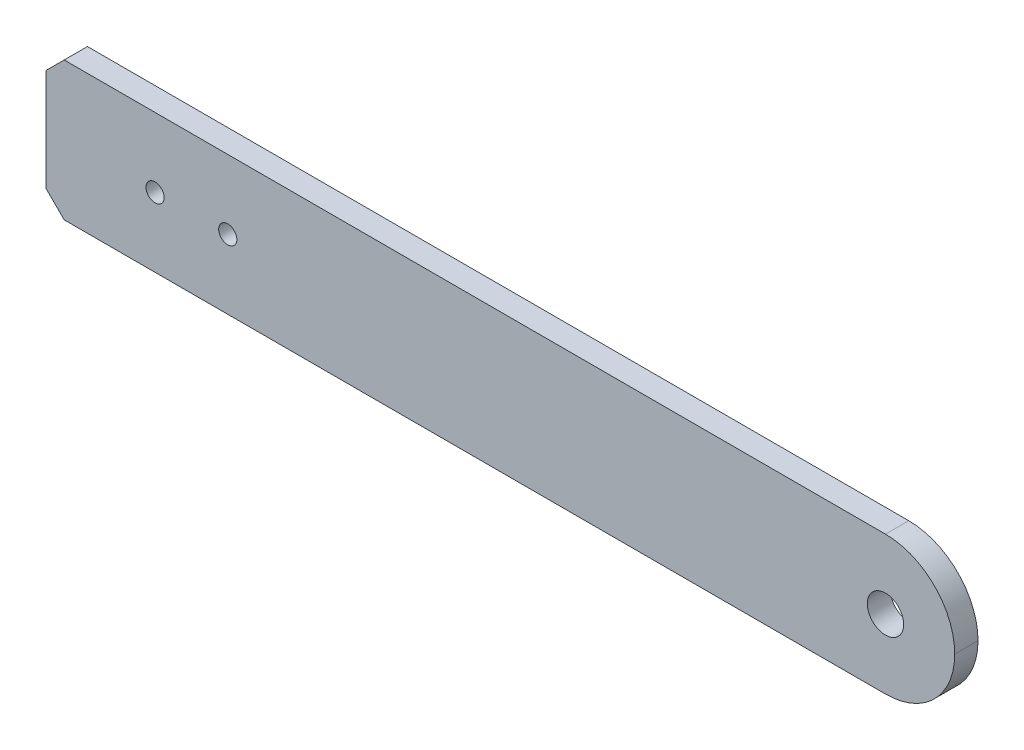
ISO-10303-21;
HEADER;
FILE_DESCRIPTION(('STEP AP214'),'2;1');
FILE_NAME('part.step','',(''),(''),'','','');
FILE_SCHEMA(('AUTOMOTIVE_DESIGN { 1 0 10303 214 1 1 1 1 }'));
ENDSEC;
DATA;
#1=APPLICATION_CONTEXT('core data for automotive mechanical design processes');
#2=APPLICATION_PROTOCOL_DEFINITION('international standard','automotive_design',2000,#1);
#3=PRODUCT_CONTEXT('',#1,'mechanical');
#4=PRODUCT('Part','Part','',(#3));
#5=PRODUCT_RELATED_PRODUCT_CATEGORY('part','',(#4));
#6=PRODUCT_DEFINITION_FORMATION('','',#4);
#7=PRODUCT_DEFINITION_CONTEXT('part definition',#1,'design');
#8=PRODUCT_DEFINITION('design','',#6,#7);
#9=PRODUCT_DEFINITION_SHAPE('','',#8);
#10=(LENGTH_UNIT() NAMED_UNIT(*) SI_UNIT(.MILLI.,.METRE.));
#11=(NAMED_UNIT(*) PLANE_ANGLE_UNIT() SI_UNIT($,.RADIAN.));
#12=(NAMED_UNIT(*) SI_UNIT($,.STERADIAN.) SOLID_ANGLE_UNIT());
#13=UNCERTAINTY_MEASURE_WITH_UNIT(LENGTH_MEASURE(1.E-05),#10,'distance_accuracy_value','');
#14=(GEOMETRIC_REPRESENTATION_CONTEXT(3) GLOBAL_UNCERTAINTY_ASSIGNED_CONTEXT((#13)) GLOBAL_UNIT_ASSIGNED_CONTEXT((#10,
#11,#12)) REPRESENTATION_CONTEXT('',''));
#15=CARTESIAN_POINT('',(0.,0.,0.));
#16=DIRECTION('',(0.,0.,1.));
#17=DIRECTION('',(1.,0.,0.));
#18=AXIS2_PLACEMENT_3D('',#15,#16,#17);
#19=CARTESIAN_POINT('',(-120.,19.05,6.4));
#20=DIRECTION('',(0.,-1.,0.));
#21=DIRECTION('',(0.,0.,-1.));
#22=AXIS2_PLACEMENT_3D('',#19,#20,#21);
#23=PLANE('',#22);
#24=DIRECTION('',(-1.,0.,0.));
#25=VECTOR('',#24,1.);
#26=CARTESIAN_POINT('',(-120.,19.05,6.4));
#27=LINE('',#26,#25);
#28=CARTESIAN_POINT('',(105.95,19.05,6.4));
#29=VERTEX_POINT('',#28);
#30=CARTESIAN_POINT('',(-120.,19.05,6.4));
#31=VERTEX_POINT('',#30);
#32=EDGE_CURVE('E104',#29,#31,#27,.T.);
#33=ORIENTED_EDGE('',*,*,#32,.F.);
#34=DIRECTION('',(0.,0.,-1.));
#35=VECTOR('',#34,1.);
#36=CARTESIAN_POINT('',(105.95,19.05,6.4));
#37=LINE('',#36,#35);
#38=CARTESIAN_POINT('',(105.95,19.05,0.));
#39=VERTEX_POINT('',#38);
#40=EDGE_CURVE('E13',#29,#39,#37,.T.);
#41=ORIENTED_EDGE('',*,*,#40,.T.);
#42=DIRECTION('',(-1.,0.,0.));
#43=VECTOR('',#42,1.);
#44=CARTESIAN_POINT('',(-120.,19.05,0.));
#45=LINE('',#44,#43);
#46=CARTESIAN_POINT('',(-120.,19.05,0.));
#47=VERTEX_POINT('',#46);
#48=EDGE_CURVE('E117',#39,#47,#45,.T.);
#49=ORIENTED_EDGE('',*,*,#48,.T.);
#50=DIRECTION('',(0.,0.,-1.));
#51=VECTOR('',#50,1.);
#52=CARTESIAN_POINT('',(-120.,19.05,6.4));
#53=LINE('',#52,#51);
#54=EDGE_CURVE('E115',#31,#47,#53,.T.);
#55=ORIENTED_EDGE('',*,*,#54,.F.);
#56=EDGE_LOOP('',(#33,#41,#49,#55));
#57=FACE_BOUND('',#56,.T.);
#58=ADVANCED_FACE('F51',(#57),#23,.F.);
#59=CARTESIAN_POINT('',(-125.,14.05,6.4));
#60=DIRECTION('',(0.707106781186547,-0.707106781186548,0.));
#61=DIRECTION('',(0.707106781186548,0.707106781186547,0.));
#62=AXIS2_PLACEMENT_3D('',#59,#60,#61);
#63=PLANE('',#62);
#64=DIRECTION('',(-0.707106781186548,-0.707106781186547,0.));
#65=VECTOR('',#64,1.);
#66=CARTESIAN_POINT('',(-125.,14.05,0.));
#67=LINE('',#66,#65);
#68=CARTESIAN_POINT('',(-125.,14.05,0.));
#69=VERTEX_POINT('',#68);
#70=EDGE_CURVE('E137',#47,#69,#67,.T.);
#71=ORIENTED_EDGE('',*,*,#70,.T.);
#72=DIRECTION('',(0.,0.,-1.));
#73=VECTOR('',#72,1.);
#74=CARTESIAN_POINT('',(-125.,14.05,6.4));
#75=LINE('',#74,#73);
#76=CARTESIAN_POINT('',(-125.,14.05,6.4));
#77=VERTEX_POINT('',#76);
#78=EDGE_CURVE('E121',#77,#69,#75,.T.);
#79=ORIENTED_EDGE('',*,*,#78,.F.);
#80=DIRECTION('',(-0.707106781186548,-0.707106781186547,0.));
#81=VECTOR('',#80,1.);
#82=CARTESIAN_POINT('',(-125.,14.05,6.4));
#83=LINE('',#82,#81);
#84=EDGE_CURVE('E108',#31,#77,#83,.T.);
#85=ORIENTED_EDGE('',*,*,#84,.F.);
#86=ORIENTED_EDGE('',*,*,#54,.T.);
#87=EDGE_LOOP('',(#71,#79,#85,#86));
#88=FACE_BOUND('',#87,.T.);
#89=ADVANCED_FACE('F123',(#88),#63,.F.);
#90=CARTESIAN_POINT('',(-125.,14.05,6.4));
#91=DIRECTION('',(1.,0.,0.));
#92=DIRECTION('',(0.,1.,0.));
#93=AXIS2_PLACEMENT_3D('',#90,#91,#92);
#94=PLANE('',#93);
#95=DIRECTION('',(0.,-1.,0.));
#96=VECTOR('',#95,1.);
#97=CARTESIAN_POINT('',(-125.,14.05,0.));
#98=LINE('',#97,#96);
#99=CARTESIAN_POINT('',(-125.,-14.05,0.));
#100=VERTEX_POINT('',#99);
#101=EDGE_CURVE('E140',#69,#100,#98,.T.);
#102=ORIENTED_EDGE('',*,*,#101,.T.);
#103=DIRECTION('',(0.,0.,-1.));
#104=VECTOR('',#103,1.);
#105=CARTESIAN_POINT('',(-125.,-14.05,6.4));
#106=LINE('',#105,#104);
#107=CARTESIAN_POINT('',(-125.,-14.05,6.4));
#108=VERTEX_POINT('',#107);
#109=EDGE_CURVE('E148',#108,#100,#106,.T.);
#110=ORIENTED_EDGE('',*,*,#109,.F.);
#111=DIRECTION('',(0.,-1.,0.));
#112=VECTOR('',#111,1.);
#113=CARTESIAN_POINT('',(-125.,14.05,6.4));
#114=LINE('',#113,#112);
#115=EDGE_CURVE('E126',#77,#108,#114,.T.);
#116=ORIENTED_EDGE('',*,*,#115,.F.);
#117=ORIENTED_EDGE('',*,*,#78,.T.);
#118=EDGE_LOOP('',(#102,#110,#116,#117));
#119=FACE_BOUND('',#118,.T.);
#120=ADVANCED_FACE('F225',(#119),#94,.F.);
#121=CARTESIAN_POINT('',(-125.,-14.05,6.4));
#122=DIRECTION('',(0.707106781186548,0.707106781186547,0.));
#123=DIRECTION('',(-0.707106781186547,0.707106781186548,0.));
#124=AXIS2_PLACEMENT_3D('',#121,#122,#123);
#125=PLANE('',#124);
#126=DIRECTION('',(0.707106781186547,-0.707106781186548,0.));
#127=VECTOR('',#126,1.);
#128=CARTESIAN_POINT('',(-125.,-14.05,0.));
#129=LINE('',#128,#127);
#130=CARTESIAN_POINT('',(-120.,-19.05,0.));
#131=VERTEX_POINT('',#130);
#132=EDGE_CURVE('E142',#100,#131,#129,.T.);
#133=ORIENTED_EDGE('',*,*,#132,.T.);
#134=DIRECTION('',(0.,0.,-1.));
#135=VECTOR('',#134,1.);
#136=CARTESIAN_POINT('',(-120.,-19.05,6.4));
#137=LINE('',#136,#135);
#138=CARTESIAN_POINT('',(-120.,-19.05,6.4));
#139=VERTEX_POINT('',#138);
#140=EDGE_CURVE('E135',#139,#131,#137,.T.);
#141=ORIENTED_EDGE('',*,*,#140,.F.);
#142=DIRECTION('',(0.707106781186547,-0.707106781186548,0.));
#143=VECTOR('',#142,1.);
#144=CARTESIAN_POINT('',(-125.,-14.05,6.4));
#145=LINE('',#144,#143);
#146=EDGE_CURVE('E128',#108,#139,#145,.T.);
#147=ORIENTED_EDGE('',*,*,#146,.F.);
#148=ORIENTED_EDGE('',*,*,#109,.T.);
#149=EDGE_LOOP('',(#133,#141,#147,#148));
#150=FACE_BOUND('',#149,.T.);
#151=ADVANCED_FACE('F170',(#150),#125,.F.);
#152=CARTESIAN_POINT('',(-120.,-19.05,6.4));
#153=DIRECTION('',(0.,1.,0.));
#154=DIRECTION('',(0.,0.,1.));
#155=AXIS2_PLACEMENT_3D('',#152,#153,#154);
#156=PLANE('',#155);
#157=DIRECTION('',(1.,0.,0.));
#158=VECTOR('',#157,1.);
#159=CARTESIAN_POINT('',(-120.,-19.05,0.));
#160=LINE('',#159,#158);
#161=CARTESIAN_POINT('',(105.95,-19.05,0.));
#162=VERTEX_POINT('',#161);
#163=EDGE_CURVE('E112',#131,#162,#160,.T.);
#164=ORIENTED_EDGE('',*,*,#163,.T.);
#165=DIRECTION('',(0.,0.,-1.));
#166=VECTOR('',#165,1.);
#167=CARTESIAN_POINT('',(105.95,-19.05,6.4));
#168=LINE('',#167,#166);
#169=CARTESIAN_POINT('',(105.95,-19.05,6.4));
#170=VERTEX_POINT('',#169);
#171=EDGE_CURVE('E155',#162,#170,#168,.F.);
#172=ORIENTED_EDGE('',*,*,#171,.T.);
#173=DIRECTION('',(1.,0.,0.));
#174=VECTOR('',#173,1.);
#175=CARTESIAN_POINT('',(-120.,-19.05,6.4));
#176=LINE('',#175,#174);
#177=EDGE_CURVE('E133',#139,#170,#176,.T.);
#178=ORIENTED_EDGE('',*,*,#177,.F.);
#179=ORIENTED_EDGE('',*,*,#140,.T.);
#180=EDGE_LOOP('',(#164,#172,#178,#179));
#181=FACE_BOUND('',#180,.T.);
#182=ADVANCED_FACE('F162',(#181),#156,.F.);
#183=CARTESIAN_POINT('',(0.,0.,6.4));
#184=DIRECTION('',(0.,0.,1.));
#185=DIRECTION('',(1.,0.,0.));
#186=AXIS2_PLACEMENT_3D('',#183,#184,#185);
#187=PLANE('',#186);
#188=CARTESIAN_POINT('',(105.95,0.,6.4));
#189=DIRECTION('',(0.,0.,1.));
#190=DIRECTION('',(1.,0.,0.));
#191=AXIS2_PLACEMENT_3D('',#188,#189,#190);
#192=CIRCLE('',#191,5.);
#193=CARTESIAN_POINT('',(110.95,0.,6.4));
#194=VERTEX_POINT('',#193);
#195=EDGE_CURVE('E186',#194,#194,#192,.T.);
#196=ORIENTED_EDGE('',*,*,#195,.F.);
#197=EDGE_LOOP('',(#196));
#198=FACE_BOUND('',#197,.T.);
#199=CARTESIAN_POINT('',(-75.,0.,6.4));
#200=DIRECTION('',(0.,0.,1.));
#201=DIRECTION('',(1.,0.,0.));
#202=AXIS2_PLACEMENT_3D('',#199,#200,#201);
#203=CIRCLE('',#202,2.49999999999999);
#204=CARTESIAN_POINT('',(-72.5,0.,6.4));
#205=VERTEX_POINT('',#204);
#206=EDGE_CURVE('E180',#205,#205,#203,.T.);
#207=ORIENTED_EDGE('',*,*,#206,.F.);
#208=EDGE_LOOP('',(#207));
#209=FACE_BOUND('',#208,.T.);
#210=CARTESIAN_POINT('',(-95.,0.,6.4));
#211=DIRECTION('',(0.,0.,1.));
#212=DIRECTION('',(1.,0.,0.));
#213=AXIS2_PLACEMENT_3D('',#210,#211,#212);
#214=CIRCLE('',#213,2.49999999999999);
#215=CARTESIAN_POINT('',(-92.5,0.,6.4));
#216=VERTEX_POINT('',#215);
#217=EDGE_CURVE('E195',#216,#216,#214,.T.);
#218=ORIENTED_EDGE('',*,*,#217,.F.);
#219=EDGE_LOOP('',(#218));
#220=FACE_BOUND('',#219,.T.);
#221=ORIENTED_EDGE('',*,*,#177,.T.);
#222=CARTESIAN_POINT('',(105.95,0.,6.4));
#223=DIRECTION('',(0.,0.,1.));
#224=DIRECTION('',(1.,0.,0.));
#225=AXIS2_PLACEMENT_3D('',#222,#223,#224);
#226=CIRCLE('',#225,19.05);
#227=CARTESIAN_POINT('',(125.,0.,6.4));
#228=VERTEX_POINT('',#227);
#229=EDGE_CURVE('E60',#170,#228,#226,.T.);
#230=ORIENTED_EDGE('',*,*,#229,.T.);
#231=CARTESIAN_POINT('',(105.95,0.,6.4));
#232=DIRECTION('',(0.,0.,1.));
#233=DIRECTION('',(1.,0.,0.));
#234=AXIS2_PLACEMENT_3D('',#231,#232,#233);
#235=CIRCLE('',#234,19.05);
#236=EDGE_CURVE('E67',#228,#29,#235,.T.);
#237=ORIENTED_EDGE('',*,*,#236,.T.);
#238=ORIENTED_EDGE('',*,*,#32,.T.);
#239=ORIENTED_EDGE('',*,*,#84,.T.);
#240=ORIENTED_EDGE('',*,*,#115,.T.);
#241=ORIENTED_EDGE('',*,*,#146,.T.);
#242=EDGE_LOOP('',(#221,#230,#237,#238,#239,#240,#241));
#243=FACE_BOUND('',#242,.T.);
#244=ADVANCED_FACE('F106',(#198,#209,#220,#243),#187,.T.);
#245=CARTESIAN_POINT('',(0.,0.,0.));
#246=DIRECTION('',(0.,0.,1.));
#247=DIRECTION('',(1.,0.,0.));
#248=AXIS2_PLACEMENT_3D('',#245,#246,#247);
#249=PLANE('',#248);
#250=CARTESIAN_POINT('',(105.95,0.,0.));
#251=DIRECTION('',(0.,0.,1.));
#252=DIRECTION('',(1.,0.,0.));
#253=AXIS2_PLACEMENT_3D('',#250,#251,#252);
#254=CIRCLE('',#253,5.);
#255=CARTESIAN_POINT('',(110.95,0.,0.));
#256=VERTEX_POINT('',#255);
#257=EDGE_CURVE('E181',#256,#256,#254,.F.);
#258=ORIENTED_EDGE('',*,*,#257,.F.);
#259=EDGE_LOOP('',(#258));
#260=FACE_BOUND('',#259,.T.);
#261=CARTESIAN_POINT('',(-75.,0.,0.));
#262=DIRECTION('',(0.,0.,1.));
#263=DIRECTION('',(1.,0.,0.));
#264=AXIS2_PLACEMENT_3D('',#261,#262,#263);
#265=CIRCLE('',#264,2.5);
#266=CARTESIAN_POINT('',(-72.5,0.,0.));
#267=VERTEX_POINT('',#266);
#268=EDGE_CURVE('E183',#267,#267,#265,.T.);
#269=ORIENTED_EDGE('',*,*,#268,.T.);
#270=EDGE_LOOP('',(#269));
#271=FACE_BOUND('',#270,.T.);
#272=CARTESIAN_POINT('',(-95.,0.,0.));
#273=DIRECTION('',(0.,0.,1.));
#274=DIRECTION('',(1.,0.,0.));
#275=AXIS2_PLACEMENT_3D('',#272,#273,#274);
#276=CIRCLE('',#275,2.5);
#277=CARTESIAN_POINT('',(-92.5,0.,0.));
#278=VERTEX_POINT('',#277);
#279=EDGE_CURVE('E138',#278,#278,#276,.T.);
#280=ORIENTED_EDGE('',*,*,#279,.T.);
#281=EDGE_LOOP('',(#280));
#282=FACE_BOUND('',#281,.T.);
#283=CARTESIAN_POINT('',(105.95,0.,0.));
#284=DIRECTION('',(0.,0.,1.));
#285=DIRECTION('',(1.,0.,0.));
#286=AXIS2_PLACEMENT_3D('',#283,#284,#285);
#287=CIRCLE('',#286,19.05);
#288=CARTESIAN_POINT('',(125.,0.,0.));
#289=VERTEX_POINT('',#288);
#290=EDGE_CURVE('E120',#39,#289,#287,.F.);
#291=ORIENTED_EDGE('',*,*,#290,.T.);
#292=CARTESIAN_POINT('',(105.95,0.,0.));
#293=DIRECTION('',(0.,0.,1.));
#294=DIRECTION('',(1.,0.,0.));
#295=AXIS2_PLACEMENT_3D('',#292,#293,#294);
#296=CIRCLE('',#295,19.05);
#297=EDGE_CURVE('E153',#289,#162,#296,.F.);
#298=ORIENTED_EDGE('',*,*,#297,.T.);
#299=ORIENTED_EDGE('',*,*,#163,.F.);
#300=ORIENTED_EDGE('',*,*,#132,.F.);
#301=ORIENTED_EDGE('',*,*,#101,.F.);
#302=ORIENTED_EDGE('',*,*,#70,.F.);
#303=ORIENTED_EDGE('',*,*,#48,.F.);
#304=EDGE_LOOP('',(#291,#298,#299,#300,#301,#302,#303));
#305=FACE_BOUND('',#304,.T.);
#306=ADVANCED_FACE('F173',(#260,#271,#282,#305),#249,.F.);
#307=CARTESIAN_POINT('',(-95.,0.,6.4));
#308=DIRECTION('',(0.,0.,1.));
#309=DIRECTION('',(1.,0.,0.));
#310=AXIS2_PLACEMENT_3D('',#307,#308,#309);
#311=CYLINDRICAL_SURFACE('',#310,2.5);
#312=ORIENTED_EDGE('',*,*,#279,.F.);
#313=EDGE_LOOP('',(#312));
#314=FACE_BOUND('',#313,.T.);
#315=ORIENTED_EDGE('',*,*,#217,.T.);
#316=EDGE_LOOP('',(#315));
#317=FACE_BOUND('',#316,.T.);
#318=ADVANCED_FACE('F201',(#314,#317),#311,.F.);
#319=CARTESIAN_POINT('',(-75.,0.,6.4));
#320=DIRECTION('',(0.,0.,1.));
#321=DIRECTION('',(1.,0.,0.));
#322=AXIS2_PLACEMENT_3D('',#319,#320,#321);
#323=CYLINDRICAL_SURFACE('',#322,2.5);
#324=ORIENTED_EDGE('',*,*,#268,.F.);
#325=EDGE_LOOP('',(#324));
#326=FACE_BOUND('',#325,.T.);
#327=ORIENTED_EDGE('',*,*,#206,.T.);
#328=EDGE_LOOP('',(#327));
#329=FACE_BOUND('',#328,.T.);
#330=ADVANCED_FACE('F204',(#326,#329),#323,.F.);
#331=CARTESIAN_POINT('',(105.95,0.,6.4));
#332=DIRECTION('',(0.,0.,-1.));
#333=DIRECTION('',(-1.,0.,0.));
#334=AXIS2_PLACEMENT_3D('',#331,#332,#333);
#335=CYLINDRICAL_SURFACE('',#334,19.05);
#336=ORIENTED_EDGE('',*,*,#40,.F.);
#337=ORIENTED_EDGE('',*,*,#236,.F.);
#338=DIRECTION('',(0.,0.,-1.));
#339=VECTOR('',#338,1.);
#340=CARTESIAN_POINT('',(125.,0.,6.4));
#341=LINE('',#340,#339);
#342=EDGE_CURVE('E55',#289,#228,#341,.F.);
#343=ORIENTED_EDGE('',*,*,#342,.F.);
#344=ORIENTED_EDGE('',*,*,#290,.F.);
#345=EDGE_LOOP('',(#336,#337,#343,#344));
#346=FACE_BOUND('',#345,.T.);
#347=ADVANCED_FACE('F53',(#346),#335,.T.);
#348=CARTESIAN_POINT('',(105.95,0.,6.4));
#349=DIRECTION('',(0.,0.,-1.));
#350=DIRECTION('',(-1.,0.,0.));
#351=AXIS2_PLACEMENT_3D('',#348,#349,#350);
#352=CYLINDRICAL_SURFACE('',#351,19.05);
#353=ORIENTED_EDGE('',*,*,#229,.F.);
#354=ORIENTED_EDGE('',*,*,#171,.F.);
#355=ORIENTED_EDGE('',*,*,#297,.F.);
#356=ORIENTED_EDGE('',*,*,#342,.T.);
#357=EDGE_LOOP('',(#353,#354,#355,#356));
#358=FACE_BOUND('',#357,.T.);
#359=ADVANCED_FACE('F178',(#358),#352,.T.);
#360=CARTESIAN_POINT('',(105.95,0.,-0.00100000000000013));
#361=DIRECTION('',(0.,0.,1.));
#362=DIRECTION('',(1.,0.,0.));
#363=AXIS2_PLACEMENT_3D('',#360,#361,#362);
#364=CYLINDRICAL_SURFACE('',#363,5.);
#365=CARTESIAN_POINT('',(110.95,0.,6.4));
#366=CARTESIAN_POINT('',(110.95,0.,6.33333333333333));
#367=CARTESIAN_POINT('',(110.95,0.,6.26666666666667));
#368=CARTESIAN_POINT('',(110.95,0.,6.13333333333333));
#369=CARTESIAN_POINT('',(110.95,0.,6.06666666666667));
#370=CARTESIAN_POINT('',(110.95,0.,5.93333333333333));
#371=CARTESIAN_POINT('',(110.95,0.,5.86666666666667));
#372=CARTESIAN_POINT('',(110.95,0.,5.73333333333333));
#373=CARTESIAN_POINT('',(110.95,0.,5.66666666666667));
#374=CARTESIAN_POINT('',(110.95,0.,5.53333333333333));
#375=CARTESIAN_POINT('',(110.95,0.,5.46666666666667));
#376=CARTESIAN_POINT('',(110.95,0.,5.33333333333333));
#377=CARTESIAN_POINT('',(110.95,0.,5.26666666666667));
#378=CARTESIAN_POINT('',(110.95,0.,5.13333333333333));
#379=CARTESIAN_POINT('',(110.95,0.,5.06666666666667));
#380=CARTESIAN_POINT('',(110.95,0.,4.93333333333333));
#381=CARTESIAN_POINT('',(110.95,0.,4.86666666666667));
#382=CARTESIAN_POINT('',(110.95,0.,4.73333333333333));
#383=CARTESIAN_POINT('',(110.95,0.,4.66666666666667));
#384=CARTESIAN_POINT('',(110.95,0.,4.53333333333333));
#385=CARTESIAN_POINT('',(110.95,0.,4.46666666666667));
#386=CARTESIAN_POINT('',(110.95,0.,4.33333333333333));
#387=CARTESIAN_POINT('',(110.95,0.,4.26666666666667));
#388=CARTESIAN_POINT('',(110.95,0.,4.13333333333333));
#389=CARTESIAN_POINT('',(110.95,0.,4.06666666666667));
#390=CARTESIAN_POINT('',(110.95,0.,3.93333333333333));
#391=CARTESIAN_POINT('',(110.95,0.,3.86666666666667));
#392=CARTESIAN_POINT('',(110.95,0.,3.73333333333333));
#393=CARTESIAN_POINT('',(110.95,0.,3.66666666666667));
#394=CARTESIAN_POINT('',(110.95,0.,3.53333333333333));
#395=CARTESIAN_POINT('',(110.95,0.,3.46666666666667));
#396=CARTESIAN_POINT('',(110.95,0.,3.33333333333333));
#397=CARTESIAN_POINT('',(110.95,0.,3.26666666666667));
#398=CARTESIAN_POINT('',(110.95,0.,3.13333333333333));
#399=CARTESIAN_POINT('',(110.95,0.,3.06666666666667));
#400=CARTESIAN_POINT('',(110.95,0.,2.93333333333333));
#401=CARTESIAN_POINT('',(110.95,0.,2.86666666666667));
#402=CARTESIAN_POINT('',(110.95,0.,2.73333333333333));
#403=CARTESIAN_POINT('',(110.95,0.,2.66666666666667));
#404=CARTESIAN_POINT('',(110.95,0.,2.53333333333333));
#405=CARTESIAN_POINT('',(110.95,0.,2.46666666666667));
#406=CARTESIAN_POINT('',(110.95,0.,2.33333333333333));
#407=CARTESIAN_POINT('',(110.95,0.,2.26666666666667));
#408=CARTESIAN_POINT('',(110.95,0.,2.13333333333333));
#409=CARTESIAN_POINT('',(110.95,0.,2.06666666666667));
#410=CARTESIAN_POINT('',(110.95,0.,1.93333333333333));
#411=CARTESIAN_POINT('',(110.95,0.,1.86666666666667));
#412=CARTESIAN_POINT('',(110.95,0.,1.73333333333333));
#413=CARTESIAN_POINT('',(110.95,0.,1.66666666666667));
#414=CARTESIAN_POINT('',(110.95,0.,1.53333333333333));
#415=CARTESIAN_POINT('',(110.95,0.,1.46666666666667));
#416=CARTESIAN_POINT('',(110.95,0.,1.33333333333333));
#417=CARTESIAN_POINT('',(110.95,0.,1.26666666666667));
#418=CARTESIAN_POINT('',(110.95,0.,1.13333333333333));
#419=CARTESIAN_POINT('',(110.95,0.,1.06666666666667));
#420=CARTESIAN_POINT('',(110.95,0.,0.933333333333333));
#421=CARTESIAN_POINT('',(110.95,0.,0.866666666666667));
#422=CARTESIAN_POINT('',(110.95,0.,0.733333333333334));
#423=CARTESIAN_POINT('',(110.95,0.,0.666666666666667));
#424=CARTESIAN_POINT('',(110.95,0.,0.533333333333333));
#425=CARTESIAN_POINT('',(110.95,0.,0.466666666666667));
#426=CARTESIAN_POINT('',(110.95,0.,0.333333333333333));
#427=CARTESIAN_POINT('',(110.95,0.,0.266666666666666));
#428=CARTESIAN_POINT('',(110.95,0.,0.133333333333333));
#429=CARTESIAN_POINT('',(110.95,0.,0.0666666666666665));
#430=CARTESIAN_POINT('',(110.95,0.,0.));
#431=B_SPLINE_CURVE_WITH_KNOTS('',3,(#365,#366,#367,#368,#369,#370,#371,#372,#373,#374,#375,
#376,#377,#378,#379,#380,#381,#382,#383,#384,#385,#386,#387,#388,#389,#390,#391,#392,#393,#394,
#395,#396,#397,#398,#399,#400,#401,#402,#403,#404,#405,#406,#407,#408,#409,#410,#411,#412,#413,
#414,#415,#416,#417,#418,#419,#420,#421,#422,#423,#424,#425,#426,#427,#428,#429,#430),
.UNSPECIFIED.,.F.,.F.,(4,2,2,2,2,2,2,2,2,2,2,2,2,2,2,2,2,2,2,2,2,2,2,2,2,2,2,2,2,2,2,2,4),(0.,
0.2,0.4,0.6,0.8,1.,1.2,1.4,1.6,1.8,2.,2.2,2.4,2.6,2.8,3.,3.2,3.4,3.6,3.8,4.,4.2,4.4,4.6,4.8,5.,
5.2,5.4,5.6,5.8,6.,6.2,6.4),.UNSPECIFIED.);
#432=EDGE_CURVE('BSEAM229',#194,#256,#431,.T.);
#433=ORIENTED_EDGE('',*,*,#195,.T.);
#434=ORIENTED_EDGE('',*,*,#257,.T.);
#435=ORIENTED_EDGE('',*,*,#432,.T.);
#436=ORIENTED_EDGE('',*,*,#432,.F.);
#437=EDGE_LOOP('',(#433,#435,#434,#436));
#438=FACE_BOUND('',#437,.T.);
#439=ADVANCED_FACE('F229',(#438),#364,.F.);
#440=CLOSED_SHELL('',(#58,#89,#120,#151,#182,#244,#306,#318,#330,#347,#359,#439));
#441=MANIFOLD_SOLID_BREP('B2',#440);
#442=ADVANCED_BREP_SHAPE_REPRESENTATION('',(#18,#441),#14);
#443=SHAPE_DEFINITION_REPRESENTATION(#9,#442);
ENDSEC;
END-ISO-10303-21;
